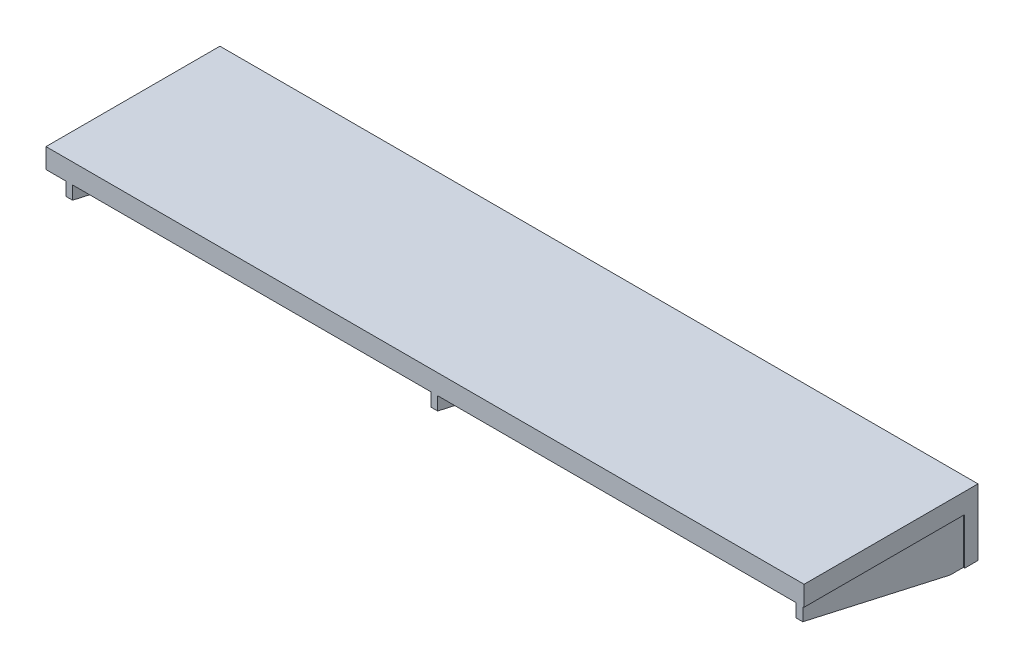
ISO-10303-21;
HEADER;
FILE_DESCRIPTION(('STEP AP214'),'2;1');
FILE_NAME('part.step','',(''),(''),'','','');
FILE_SCHEMA(('AUTOMOTIVE_DESIGN { 1 0 10303 214 1 1 1 1 }'));
ENDSEC;
DATA;
#1=APPLICATION_CONTEXT('core data for automotive mechanical design processes');
#2=APPLICATION_PROTOCOL_DEFINITION('international standard','automotive_design',2000,#1);
#3=PRODUCT_CONTEXT('',#1,'mechanical');
#4=PRODUCT('Part','Part','',(#3));
#5=PRODUCT_RELATED_PRODUCT_CATEGORY('part','',(#4));
#6=PRODUCT_DEFINITION_FORMATION('','',#4);
#7=PRODUCT_DEFINITION_CONTEXT('part definition',#1,'design');
#8=PRODUCT_DEFINITION('design','',#6,#7);
#9=PRODUCT_DEFINITION_SHAPE('','',#8);
#10=(LENGTH_UNIT() NAMED_UNIT(*) SI_UNIT(.MILLI.,.METRE.));
#11=(NAMED_UNIT(*) PLANE_ANGLE_UNIT() SI_UNIT($,.RADIAN.));
#12=(NAMED_UNIT(*) SI_UNIT($,.STERADIAN.) SOLID_ANGLE_UNIT());
#13=UNCERTAINTY_MEASURE_WITH_UNIT(LENGTH_MEASURE(1.E-05),#10,'distance_accuracy_value','');
#14=(GEOMETRIC_REPRESENTATION_CONTEXT(3) GLOBAL_UNCERTAINTY_ASSIGNED_CONTEXT((#13)) GLOBAL_UNIT_ASSIGNED_CONTEXT((#10,
#11,#12)) REPRESENTATION_CONTEXT('',''));
#15=CARTESIAN_POINT('',(0.,0.,0.));
#16=DIRECTION('',(0.,0.,1.));
#17=DIRECTION('',(1.,0.,0.));
#18=AXIS2_PLACEMENT_3D('',#15,#16,#17);
#19=CARTESIAN_POINT('',(0.,0.,20.));
#20=DIRECTION('',(0.,0.,-1.));
#21=DIRECTION('',(-1.,0.,0.));
#22=AXIS2_PLACEMENT_3D('',#19,#20,#21);
#23=PLANE('',#22);
#24=DIRECTION('',(0.,-1.,0.));
#25=VECTOR('',#24,1.);
#26=CARTESIAN_POINT('',(569.,20.,20.));
#27=LINE('',#26,#25);
#28=CARTESIAN_POINT('',(569.,20.,20.));
#29=VERTEX_POINT('',#28);
#30=CARTESIAN_POINT('',(569.,-50.,20.));
#31=VERTEX_POINT('',#30);
#32=EDGE_CURVE('E181',#29,#31,#27,.T.);
#33=ORIENTED_EDGE('',*,*,#32,.T.);
#34=DIRECTION('',(1.,0.,0.));
#35=VECTOR('',#34,1.);
#36=CARTESIAN_POINT('',(-571.,-50.,20.));
#37=LINE('',#36,#35);
#38=CARTESIAN_POINT('',(571.,-50.,20.));
#39=VERTEX_POINT('',#38);
#40=EDGE_CURVE('E39',#31,#39,#37,.T.);
#41=ORIENTED_EDGE('',*,*,#40,.T.);
#42=DIRECTION('',(0.,1.,0.));
#43=VECTOR('',#42,1.);
#44=CARTESIAN_POINT('',(571.,-50.,20.));
#45=LINE('',#44,#43);
#46=CARTESIAN_POINT('',(571.,20.,20.));
#47=VERTEX_POINT('',#46);
#48=EDGE_CURVE('E202',#39,#47,#45,.T.);
#49=ORIENTED_EDGE('',*,*,#48,.T.);
#50=DIRECTION('',(1.,0.,0.));
#51=VECTOR('',#50,1.);
#52=CARTESIAN_POINT('',(-571.,20.,20.));
#53=LINE('',#52,#51);
#54=EDGE_CURVE('E196',#29,#47,#53,.T.);
#55=ORIENTED_EDGE('',*,*,#54,.F.);
#56=EDGE_LOOP('',(#33,#41,#49,#55));
#57=FACE_BOUND('',#56,.T.);
#58=ADVANCED_FACE('F35',(#57),#23,.F.);
#59=CARTESIAN_POINT('',(-571.,20.,262.));
#60=DIRECTION('',(0.,1.,0.));
#61=DIRECTION('',(0.,0.,1.));
#62=AXIS2_PLACEMENT_3D('',#59,#60,#61);
#63=PLANE('',#62);
#64=DIRECTION('',(0.,0.,-1.));
#65=VECTOR('',#64,1.);
#66=CARTESIAN_POINT('',(569.,20.,262.));
#67=LINE('',#66,#65);
#68=CARTESIAN_POINT('',(569.,20.,262.));
#69=VERTEX_POINT('',#68);
#70=EDGE_CURVE('E184',#69,#29,#67,.T.);
#71=ORIENTED_EDGE('',*,*,#70,.T.);
#72=ORIENTED_EDGE('',*,*,#54,.T.);
#73=DIRECTION('',(0.,0.,-1.));
#74=VECTOR('',#73,1.);
#75=CARTESIAN_POINT('',(571.,20.,262.));
#76=LINE('',#75,#74);
#77=CARTESIAN_POINT('',(571.,20.,262.));
#78=VERTEX_POINT('',#77);
#79=EDGE_CURVE('E340',#78,#47,#76,.T.);
#80=ORIENTED_EDGE('',*,*,#79,.F.);
#81=DIRECTION('',(1.,0.,0.));
#82=VECTOR('',#81,1.);
#83=CARTESIAN_POINT('',(-571.,20.,262.));
#84=LINE('',#83,#82);
#85=EDGE_CURVE('E198',#69,#78,#84,.T.);
#86=ORIENTED_EDGE('',*,*,#85,.F.);
#87=EDGE_LOOP('',(#71,#72,#80,#86));
#88=FACE_BOUND('',#87,.T.);
#89=ADVANCED_FACE('F194',(#88),#63,.F.);
#90=CARTESIAN_POINT('',(19.0000000000002,-50.,20.));
#91=VERTEX_POINT('',#90);
#92=CARTESIAN_POINT('',(559.,-50.,20.));
#93=VERTEX_POINT('',#92);
#94=EDGE_CURVE('E285',#91,#93,#37,.T.);
#95=ORIENTED_EDGE('',*,*,#94,.T.);
#96=DIRECTION('',(0.,-1.,0.));
#97=VECTOR('',#96,1.);
#98=CARTESIAN_POINT('',(559.,20.,20.));
#99=LINE('',#98,#97);
#100=CARTESIAN_POINT('',(559.,20.,20.));
#101=VERTEX_POINT('',#100);
#102=EDGE_CURVE('E546',#101,#93,#99,.T.);
#103=ORIENTED_EDGE('',*,*,#102,.F.);
#104=CARTESIAN_POINT('',(19.0000000000002,20.,20.));
#105=VERTEX_POINT('',#104);
#106=EDGE_CURVE('E203',#105,#101,#53,.T.);
#107=ORIENTED_EDGE('',*,*,#106,.F.);
#108=DIRECTION('',(0.,-1.,0.));
#109=VECTOR('',#108,1.);
#110=CARTESIAN_POINT('',(19.0000000000002,20.,20.));
#111=LINE('',#110,#109);
#112=EDGE_CURVE('E562',#105,#91,#111,.T.);
#113=ORIENTED_EDGE('',*,*,#112,.T.);
#114=EDGE_LOOP('',(#95,#103,#107,#113));
#115=FACE_BOUND('',#114,.T.);
#116=ADVANCED_FACE('F379',(#115),#23,.F.);
#117=ORIENTED_EDGE('',*,*,#106,.T.);
#118=DIRECTION('',(0.,0.,-1.));
#119=VECTOR('',#118,1.);
#120=CARTESIAN_POINT('',(559.,20.,262.));
#121=LINE('',#120,#119);
#122=CARTESIAN_POINT('',(559.,20.,262.));
#123=VERTEX_POINT('',#122);
#124=EDGE_CURVE('E538',#123,#101,#121,.T.);
#125=ORIENTED_EDGE('',*,*,#124,.F.);
#126=CARTESIAN_POINT('',(19.0000000000002,20.,262.));
#127=VERTEX_POINT('',#126);
#128=EDGE_CURVE('E346',#127,#123,#84,.T.);
#129=ORIENTED_EDGE('',*,*,#128,.F.);
#130=DIRECTION('',(0.,0.,-1.));
#131=VECTOR('',#130,1.);
#132=CARTESIAN_POINT('',(19.0000000000002,20.,262.));
#133=LINE('',#132,#131);
#134=EDGE_CURVE('E560',#127,#105,#133,.T.);
#135=ORIENTED_EDGE('',*,*,#134,.T.);
#136=EDGE_LOOP('',(#117,#125,#129,#135));
#137=FACE_BOUND('',#136,.T.);
#138=ADVANCED_FACE('F384',(#137),#63,.F.);
#139=CARTESIAN_POINT('',(-571.,20.,20.));
#140=VERTEX_POINT('',#139);
#141=CARTESIAN_POINT('',(-541.,20.,20.));
#142=VERTEX_POINT('',#141);
#143=EDGE_CURVE('E206',#140,#142,#53,.T.);
#144=ORIENTED_EDGE('',*,*,#143,.F.);
#145=DIRECTION('',(0.,-1.,0.));
#146=VECTOR('',#145,1.);
#147=CARTESIAN_POINT('',(-571.,-50.,20.));
#148=LINE('',#147,#146);
#149=CARTESIAN_POINT('',(-571.,-50.,20.));
#150=VERTEX_POINT('',#149);
#151=EDGE_CURVE('E276',#140,#150,#148,.T.);
#152=ORIENTED_EDGE('',*,*,#151,.T.);
#153=CARTESIAN_POINT('',(-541.,-50.,20.));
#154=VERTEX_POINT('',#153);
#155=EDGE_CURVE('E284',#150,#154,#37,.T.);
#156=ORIENTED_EDGE('',*,*,#155,.T.);
#157=DIRECTION('',(0.,-1.,0.));
#158=VECTOR('',#157,1.);
#159=CARTESIAN_POINT('',(-541.,20.,20.));
#160=LINE('',#159,#158);
#161=EDGE_CURVE('E266',#142,#154,#160,.T.);
#162=ORIENTED_EDGE('',*,*,#161,.F.);
#163=EDGE_LOOP('',(#144,#152,#156,#162));
#164=FACE_BOUND('',#163,.T.);
#165=ADVANCED_FACE('F310',(#164),#23,.F.);
#166=CARTESIAN_POINT('',(-531.,-50.,20.));
#167=VERTEX_POINT('',#166);
#168=CARTESIAN_POINT('',(9.0000000000002,-50.,20.));
#169=VERTEX_POINT('',#168);
#170=EDGE_CURVE('E251',#167,#169,#37,.T.);
#171=ORIENTED_EDGE('',*,*,#170,.T.);
#172=DIRECTION('',(0.,-1.,0.));
#173=VECTOR('',#172,1.);
#174=CARTESIAN_POINT('',(9.0000000000002,20.,20.));
#175=LINE('',#174,#173);
#176=CARTESIAN_POINT('',(9.0000000000002,20.,20.));
#177=VERTEX_POINT('',#176);
#178=EDGE_CURVE('E236',#177,#169,#175,.T.);
#179=ORIENTED_EDGE('',*,*,#178,.F.);
#180=CARTESIAN_POINT('',(-531.,20.,20.));
#181=VERTEX_POINT('',#180);
#182=EDGE_CURVE('E208',#181,#177,#53,.T.);
#183=ORIENTED_EDGE('',*,*,#182,.F.);
#184=DIRECTION('',(0.,-1.,0.));
#185=VECTOR('',#184,1.);
#186=CARTESIAN_POINT('',(-531.,20.,20.));
#187=LINE('',#186,#185);
#188=EDGE_CURVE('E233',#181,#167,#187,.T.);
#189=ORIENTED_EDGE('',*,*,#188,.T.);
#190=EDGE_LOOP('',(#171,#179,#183,#189));
#191=FACE_BOUND('',#190,.T.);
#192=ADVANCED_FACE('F232',(#191),#23,.F.);
#193=CARTESIAN_POINT('',(571.,-50.,20.));
#194=DIRECTION('',(-1.,0.,0.));
#195=DIRECTION('',(0.,0.,1.));
#196=AXIS2_PLACEMENT_3D('',#193,#194,#195);
#197=PLANE('',#196);
#198=DIRECTION('',(0.,1.,0.));
#199=VECTOR('',#198,1.);
#200=CARTESIAN_POINT('',(571.,-50.,0.));
#201=LINE('',#200,#199);
#202=CARTESIAN_POINT('',(571.,-50.,0.));
#203=VERTEX_POINT('',#202);
#204=CARTESIAN_POINT('',(571.,50.,0.));
#205=VERTEX_POINT('',#204);
#206=EDGE_CURVE('E273',#203,#205,#201,.T.);
#207=ORIENTED_EDGE('',*,*,#206,.T.);
#208=DIRECTION('',(0.,0.,-1.));
#209=VECTOR('',#208,1.);
#210=CARTESIAN_POINT('',(571.,50.,20.));
#211=LINE('',#210,#209);
#212=CARTESIAN_POINT('',(571.,50.,262.));
#213=VERTEX_POINT('',#212);
#214=EDGE_CURVE('E11',#213,#205,#211,.T.);
#215=ORIENTED_EDGE('',*,*,#214,.F.);
#216=DIRECTION('',(0.,1.,0.));
#217=VECTOR('',#216,1.);
#218=CARTESIAN_POINT('',(571.,50.,262.));
#219=LINE('',#218,#217);
#220=EDGE_CURVE('E335',#78,#213,#219,.T.);
#221=ORIENTED_EDGE('',*,*,#220,.F.);
#222=ORIENTED_EDGE('',*,*,#79,.T.);
#223=ORIENTED_EDGE('',*,*,#48,.F.);
#224=DIRECTION('',(0.,0.,-1.));
#225=VECTOR('',#224,1.);
#226=CARTESIAN_POINT('',(571.,-50.,20.));
#227=LINE('',#226,#225);
#228=EDGE_CURVE('E314',#39,#203,#227,.T.);
#229=ORIENTED_EDGE('',*,*,#228,.T.);
#230=EDGE_LOOP('',(#207,#215,#221,#222,#223,#229));
#231=FACE_BOUND('',#230,.T.);
#232=ADVANCED_FACE('F37',(#231),#197,.F.);
#233=CARTESIAN_POINT('',(-571.,50.,20.));
#234=DIRECTION('',(0.,-1.,0.));
#235=DIRECTION('',(0.,0.,-1.));
#236=AXIS2_PLACEMENT_3D('',#233,#234,#235);
#237=PLANE('',#236);
#238=DIRECTION('',(-1.,0.,0.));
#239=VECTOR('',#238,1.);
#240=CARTESIAN_POINT('',(-571.,50.,0.));
#241=LINE('',#240,#239);
#242=CARTESIAN_POINT('',(-571.,50.,0.));
#243=VERTEX_POINT('',#242);
#244=EDGE_CURVE('E355',#205,#243,#241,.T.);
#245=ORIENTED_EDGE('',*,*,#244,.T.);
#246=DIRECTION('',(0.,0.,-1.));
#247=VECTOR('',#246,1.);
#248=CARTESIAN_POINT('',(-571.,50.,20.));
#249=LINE('',#248,#247);
#250=CARTESIAN_POINT('',(-571.,50.,262.));
#251=VERTEX_POINT('',#250);
#252=EDGE_CURVE('E45',#251,#243,#249,.T.);
#253=ORIENTED_EDGE('',*,*,#252,.F.);
#254=DIRECTION('',(-1.,0.,0.));
#255=VECTOR('',#254,1.);
#256=CARTESIAN_POINT('',(-571.,50.,262.));
#257=LINE('',#256,#255);
#258=EDGE_CURVE('E338',#213,#251,#257,.T.);
#259=ORIENTED_EDGE('',*,*,#258,.F.);
#260=ORIENTED_EDGE('',*,*,#214,.T.);
#261=EDGE_LOOP('',(#245,#253,#259,#260));
#262=FACE_BOUND('',#261,.T.);
#263=ADVANCED_FACE('F354',(#262),#237,.F.);
#264=CARTESIAN_POINT('',(-571.,-50.,20.));
#265=DIRECTION('',(1.,0.,0.));
#266=DIRECTION('',(0.,0.,-1.));
#267=AXIS2_PLACEMENT_3D('',#264,#265,#266);
#268=PLANE('',#267);
#269=DIRECTION('',(0.,-1.,0.));
#270=VECTOR('',#269,1.);
#271=CARTESIAN_POINT('',(-571.,-50.,0.));
#272=LINE('',#271,#270);
#273=CARTESIAN_POINT('',(-571.,-50.,0.));
#274=VERTEX_POINT('',#273);
#275=EDGE_CURVE('E363',#243,#274,#272,.T.);
#276=ORIENTED_EDGE('',*,*,#275,.T.);
#277=DIRECTION('',(0.,0.,-1.));
#278=VECTOR('',#277,1.);
#279=CARTESIAN_POINT('',(-571.,-50.,20.));
#280=LINE('',#279,#278);
#281=EDGE_CURVE('E316',#150,#274,#280,.T.);
#282=ORIENTED_EDGE('',*,*,#281,.F.);
#283=ORIENTED_EDGE('',*,*,#151,.F.);
#284=DIRECTION('',(0.,0.,-1.));
#285=VECTOR('',#284,1.);
#286=CARTESIAN_POINT('',(-571.,20.,262.));
#287=LINE('',#286,#285);
#288=CARTESIAN_POINT('',(-571.,20.,262.));
#289=VERTEX_POINT('',#288);
#290=EDGE_CURVE('E264',#289,#140,#287,.T.);
#291=ORIENTED_EDGE('',*,*,#290,.F.);
#292=DIRECTION('',(0.,-1.,0.));
#293=VECTOR('',#292,1.);
#294=CARTESIAN_POINT('',(-571.,50.,262.));
#295=LINE('',#294,#293);
#296=EDGE_CURVE('E213',#251,#289,#295,.T.);
#297=ORIENTED_EDGE('',*,*,#296,.F.);
#298=ORIENTED_EDGE('',*,*,#252,.T.);
#299=EDGE_LOOP('',(#276,#282,#283,#291,#297,#298));
#300=FACE_BOUND('',#299,.T.);
#301=ADVANCED_FACE('F364',(#300),#268,.F.);
#302=CARTESIAN_POINT('',(-571.,-50.,20.));
#303=DIRECTION('',(0.,1.,0.));
#304=DIRECTION('',(0.,0.,1.));
#305=AXIS2_PLACEMENT_3D('',#302,#303,#304);
#306=PLANE('',#305);
#307=DIRECTION('',(1.,0.,0.));
#308=VECTOR('',#307,1.);
#309=CARTESIAN_POINT('',(-571.,-50.,0.));
#310=LINE('',#309,#308);
#311=EDGE_CURVE('E277',#274,#203,#310,.T.);
#312=ORIENTED_EDGE('',*,*,#311,.T.);
#313=ORIENTED_EDGE('',*,*,#228,.F.);
#314=ORIENTED_EDGE('',*,*,#40,.F.);
#315=DIRECTION('',(0.,0.,1.));
#316=VECTOR('',#315,1.);
#317=CARTESIAN_POINT('',(569.,-50.,20.));
#318=LINE('',#317,#316);
#319=CARTESIAN_POINT('',(569.,-50.,40.));
#320=VERTEX_POINT('',#319);
#321=EDGE_CURVE('E188',#31,#320,#318,.T.);
#322=ORIENTED_EDGE('',*,*,#321,.T.);
#323=DIRECTION('',(-1.,0.,0.));
#324=VECTOR('',#323,1.);
#325=CARTESIAN_POINT('',(569.,-50.,40.));
#326=LINE('',#325,#324);
#327=CARTESIAN_POINT('',(559.,-50.,40.));
#328=VERTEX_POINT('',#327);
#329=EDGE_CURVE('E556',#320,#328,#326,.T.);
#330=ORIENTED_EDGE('',*,*,#329,.T.);
#331=DIRECTION('',(0.,0.,1.));
#332=VECTOR('',#331,1.);
#333=CARTESIAN_POINT('',(559.,-50.,20.));
#334=LINE('',#333,#332);
#335=EDGE_CURVE('E548',#93,#328,#334,.T.);
#336=ORIENTED_EDGE('',*,*,#335,.F.);
#337=ORIENTED_EDGE('',*,*,#94,.F.);
#338=DIRECTION('',(0.,0.,1.));
#339=VECTOR('',#338,1.);
#340=CARTESIAN_POINT('',(19.0000000000002,-50.,20.));
#341=LINE('',#340,#339);
#342=CARTESIAN_POINT('',(19.0000000000002,-50.,40.));
#343=VERTEX_POINT('',#342);
#344=EDGE_CURVE('E565',#91,#343,#341,.T.);
#345=ORIENTED_EDGE('',*,*,#344,.T.);
#346=DIRECTION('',(-1.,0.,0.));
#347=VECTOR('',#346,1.);
#348=CARTESIAN_POINT('',(19.0000000000002,-50.,40.));
#349=LINE('',#348,#347);
#350=CARTESIAN_POINT('',(9.0000000000002,-50.,40.));
#351=VERTEX_POINT('',#350);
#352=EDGE_CURVE('E209',#343,#351,#349,.T.);
#353=ORIENTED_EDGE('',*,*,#352,.T.);
#354=DIRECTION('',(0.,0.,1.));
#355=VECTOR('',#354,1.);
#356=CARTESIAN_POINT('',(9.0000000000002,-50.,20.));
#357=LINE('',#356,#355);
#358=EDGE_CURVE('E320',#169,#351,#357,.T.);
#359=ORIENTED_EDGE('',*,*,#358,.F.);
#360=ORIENTED_EDGE('',*,*,#170,.F.);
#361=DIRECTION('',(0.,0.,1.));
#362=VECTOR('',#361,1.);
#363=CARTESIAN_POINT('',(-531.,-50.,20.));
#364=LINE('',#363,#362);
#365=CARTESIAN_POINT('',(-531.,-50.,40.));
#366=VERTEX_POINT('',#365);
#367=EDGE_CURVE('E243',#167,#366,#364,.T.);
#368=ORIENTED_EDGE('',*,*,#367,.T.);
#369=DIRECTION('',(-1.,0.,0.));
#370=VECTOR('',#369,1.);
#371=CARTESIAN_POINT('',(-531.,-50.,40.));
#372=LINE('',#371,#370);
#373=CARTESIAN_POINT('',(-541.,-50.,40.));
#374=VERTEX_POINT('',#373);
#375=EDGE_CURVE('E259',#366,#374,#372,.T.);
#376=ORIENTED_EDGE('',*,*,#375,.T.);
#377=DIRECTION('',(0.,0.,1.));
#378=VECTOR('',#377,1.);
#379=CARTESIAN_POINT('',(-541.,-50.,20.));
#380=LINE('',#379,#378);
#381=EDGE_CURVE('E270',#154,#374,#380,.T.);
#382=ORIENTED_EDGE('',*,*,#381,.F.);
#383=ORIENTED_EDGE('',*,*,#155,.F.);
#384=ORIENTED_EDGE('',*,*,#281,.T.);
#385=EDGE_LOOP('',(#312,#313,#314,#322,#330,#336,#337,#345,#353,#359,#360,#368,#376,#382,#383,#384));
#386=FACE_BOUND('',#385,.T.);
#387=ADVANCED_FACE('F318',(#386),#306,.F.);
#388=CARTESIAN_POINT('',(0.,0.,0.));
#389=DIRECTION('',(0.,0.,-1.));
#390=DIRECTION('',(-1.,0.,0.));
#391=AXIS2_PLACEMENT_3D('',#388,#389,#390);
#392=PLANE('',#391);
#393=ORIENTED_EDGE('',*,*,#206,.F.);
#394=ORIENTED_EDGE('',*,*,#311,.F.);
#395=ORIENTED_EDGE('',*,*,#275,.F.);
#396=ORIENTED_EDGE('',*,*,#244,.F.);
#397=EDGE_LOOP('',(#393,#394,#395,#396));
#398=FACE_BOUND('',#397,.T.);
#399=ADVANCED_FACE('F368',(#398),#392,.T.);
#400=CARTESIAN_POINT('',(-531.,0.,262.));
#401=DIRECTION('',(0.,0.,1.));
#402=DIRECTION('',(1.,0.,0.));
#403=AXIS2_PLACEMENT_3D('',#400,#401,#402);
#404=PLANE('',#403);
#405=DIRECTION('',(0.,1.,0.));
#406=VECTOR('',#405,1.);
#407=CARTESIAN_POINT('',(-541.,0.,262.));
#408=LINE('',#407,#406);
#409=CARTESIAN_POINT('',(-541.,0.,262.));
#410=VERTEX_POINT('',#409);
#411=CARTESIAN_POINT('',(-541.,20.,262.));
#412=VERTEX_POINT('',#411);
#413=EDGE_CURVE('E260',#410,#412,#408,.T.);
#414=ORIENTED_EDGE('',*,*,#413,.F.);
#415=DIRECTION('',(-1.,0.,0.));
#416=VECTOR('',#415,1.);
#417=CARTESIAN_POINT('',(-531.,0.,262.));
#418=LINE('',#417,#416);
#419=CARTESIAN_POINT('',(-531.,0.,262.));
#420=VERTEX_POINT('',#419);
#421=EDGE_CURVE('E271',#420,#410,#418,.T.);
#422=ORIENTED_EDGE('',*,*,#421,.F.);
#423=DIRECTION('',(0.,1.,0.));
#424=VECTOR('',#423,1.);
#425=CARTESIAN_POINT('',(-531.,0.,262.));
#426=LINE('',#425,#424);
#427=CARTESIAN_POINT('',(-531.,20.,262.));
#428=VERTEX_POINT('',#427);
#429=EDGE_CURVE('E247',#420,#428,#426,.T.);
#430=ORIENTED_EDGE('',*,*,#429,.T.);
#431=CARTESIAN_POINT('',(9.00000000000023,20.,262.));
#432=VERTEX_POINT('',#431);
#433=EDGE_CURVE('E336',#428,#432,#84,.T.);
#434=ORIENTED_EDGE('',*,*,#433,.T.);
#435=DIRECTION('',(0.,1.,0.));
#436=VECTOR('',#435,1.);
#437=CARTESIAN_POINT('',(9.0000000000002,0.,262.));
#438=LINE('',#437,#436);
#439=CARTESIAN_POINT('',(9.0000000000002,0.,262.));
#440=VERTEX_POINT('',#439);
#441=EDGE_CURVE('E61',#440,#432,#438,.T.);
#442=ORIENTED_EDGE('',*,*,#441,.F.);
#443=DIRECTION('',(-1.,0.,0.));
#444=VECTOR('',#443,1.);
#445=CARTESIAN_POINT('',(19.0000000000002,0.,262.));
#446=LINE('',#445,#444);
#447=CARTESIAN_POINT('',(19.0000000000002,0.,262.));
#448=VERTEX_POINT('',#447);
#449=EDGE_CURVE('E204',#448,#440,#446,.T.);
#450=ORIENTED_EDGE('',*,*,#449,.F.);
#451=DIRECTION('',(0.,1.,0.));
#452=VECTOR('',#451,1.);
#453=CARTESIAN_POINT('',(19.0000000000002,0.,262.));
#454=LINE('',#453,#452);
#455=EDGE_CURVE('E330',#448,#127,#454,.T.);
#456=ORIENTED_EDGE('',*,*,#455,.T.);
#457=ORIENTED_EDGE('',*,*,#128,.T.);
#458=DIRECTION('',(0.,1.,0.));
#459=VECTOR('',#458,1.);
#460=CARTESIAN_POINT('',(559.,0.,262.));
#461=LINE('',#460,#459);
#462=CARTESIAN_POINT('',(559.,0.,262.));
#463=VERTEX_POINT('',#462);
#464=EDGE_CURVE('E535',#463,#123,#461,.T.);
#465=ORIENTED_EDGE('',*,*,#464,.F.);
#466=DIRECTION('',(-1.,0.,0.));
#467=VECTOR('',#466,1.);
#468=CARTESIAN_POINT('',(569.,0.,262.));
#469=LINE('',#468,#467);
#470=CARTESIAN_POINT('',(569.,0.,262.));
#471=VERTEX_POINT('',#470);
#472=EDGE_CURVE('E554',#471,#463,#469,.T.);
#473=ORIENTED_EDGE('',*,*,#472,.F.);
#474=DIRECTION('',(0.,1.,0.));
#475=VECTOR('',#474,1.);
#476=CARTESIAN_POINT('',(569.,0.,262.));
#477=LINE('',#476,#475);
#478=EDGE_CURVE('E53',#471,#69,#477,.T.);
#479=ORIENTED_EDGE('',*,*,#478,.T.);
#480=ORIENTED_EDGE('',*,*,#85,.T.);
#481=ORIENTED_EDGE('',*,*,#220,.T.);
#482=ORIENTED_EDGE('',*,*,#258,.T.);
#483=ORIENTED_EDGE('',*,*,#296,.T.);
#484=EDGE_CURVE('E308',#289,#412,#84,.T.);
#485=ORIENTED_EDGE('',*,*,#484,.T.);
#486=EDGE_LOOP('',(#414,#422,#430,#434,#442,#450,#456,#457,#465,#473,#479,#480,#481,#482,#483,#485));
#487=FACE_BOUND('',#486,.T.);
#488=ADVANCED_FACE('F307',(#487),#404,.T.);
#489=CARTESIAN_POINT('',(-531.,-50.,40.));
#490=DIRECTION('',(0.,-0.975562678550501,0.21972132399786));
#491=DIRECTION('',(0.,-0.21972132399786,-0.975562678550501));
#492=AXIS2_PLACEMENT_3D('',#489,#490,#491);
#493=PLANE('',#492);
#494=DIRECTION('',(0.,0.21972132399786,0.9755626785505));
#495=VECTOR('',#494,1.);
#496=CARTESIAN_POINT('',(-541.,-50.,40.));
#497=LINE('',#496,#495);
#498=EDGE_CURVE('E267',#374,#410,#497,.T.);
#499=ORIENTED_EDGE('',*,*,#498,.F.);
#500=ORIENTED_EDGE('',*,*,#375,.F.);
#501=DIRECTION('',(0.,0.21972132399786,0.9755626785505));
#502=VECTOR('',#501,1.);
#503=CARTESIAN_POINT('',(-531.,-50.,40.));
#504=LINE('',#503,#502);
#505=EDGE_CURVE('E245',#366,#420,#504,.T.);
#506=ORIENTED_EDGE('',*,*,#505,.T.);
#507=ORIENTED_EDGE('',*,*,#421,.T.);
#508=EDGE_LOOP('',(#499,#500,#506,#507));
#509=FACE_BOUND('',#508,.T.);
#510=ADVANCED_FACE('F304',(#509),#493,.T.);
#511=CARTESIAN_POINT('',(-531.,0.,0.));
#512=DIRECTION('',(-1.,0.,0.));
#513=DIRECTION('',(0.,0.,1.));
#514=AXIS2_PLACEMENT_3D('',#511,#512,#513);
#515=PLANE('',#514);
#516=ORIENTED_EDGE('',*,*,#429,.F.);
#517=ORIENTED_EDGE('',*,*,#505,.F.);
#518=ORIENTED_EDGE('',*,*,#367,.F.);
#519=ORIENTED_EDGE('',*,*,#188,.F.);
#520=DIRECTION('',(0.,0.,-1.));
#521=VECTOR('',#520,1.);
#522=CARTESIAN_POINT('',(-531.,20.,262.));
#523=LINE('',#522,#521);
#524=EDGE_CURVE('E226',#428,#181,#523,.T.);
#525=ORIENTED_EDGE('',*,*,#524,.F.);
#526=EDGE_LOOP('',(#516,#517,#518,#519,#525));
#527=FACE_BOUND('',#526,.T.);
#528=ADVANCED_FACE('F239',(#527),#515,.F.);
#529=CARTESIAN_POINT('',(-541.,0.,0.));
#530=DIRECTION('',(-1.,0.,0.));
#531=DIRECTION('',(0.,0.,1.));
#532=AXIS2_PLACEMENT_3D('',#529,#530,#531);
#533=PLANE('',#532);
#534=ORIENTED_EDGE('',*,*,#413,.T.);
#535=DIRECTION('',(0.,0.,-1.));
#536=VECTOR('',#535,1.);
#537=CARTESIAN_POINT('',(-541.,20.,262.));
#538=LINE('',#537,#536);
#539=EDGE_CURVE('E263',#412,#142,#538,.T.);
#540=ORIENTED_EDGE('',*,*,#539,.T.);
#541=ORIENTED_EDGE('',*,*,#161,.T.);
#542=ORIENTED_EDGE('',*,*,#381,.T.);
#543=ORIENTED_EDGE('',*,*,#498,.T.);
#544=EDGE_LOOP('',(#534,#540,#541,#542,#543));
#545=FACE_BOUND('',#544,.T.);
#546=ADVANCED_FACE('F298',(#545),#533,.T.);
#547=ORIENTED_EDGE('',*,*,#182,.T.);
#548=DIRECTION('',(0.,0.,-1.));
#549=VECTOR('',#548,1.);
#550=CARTESIAN_POINT('',(9.0000000000002,20.,262.));
#551=LINE('',#550,#549);
#552=EDGE_CURVE('E223',#432,#177,#551,.T.);
#553=ORIENTED_EDGE('',*,*,#552,.F.);
#554=ORIENTED_EDGE('',*,*,#433,.F.);
#555=ORIENTED_EDGE('',*,*,#524,.T.);
#556=EDGE_LOOP('',(#547,#553,#554,#555));
#557=FACE_BOUND('',#556,.T.);
#558=ADVANCED_FACE('F222',(#557),#63,.F.);
#559=ORIENTED_EDGE('',*,*,#539,.F.);
#560=ORIENTED_EDGE('',*,*,#484,.F.);
#561=ORIENTED_EDGE('',*,*,#290,.T.);
#562=ORIENTED_EDGE('',*,*,#143,.T.);
#563=EDGE_LOOP('',(#559,#560,#561,#562));
#564=FACE_BOUND('',#563,.T.);
#565=ADVANCED_FACE('F385',(#564),#63,.F.);
#566=CARTESIAN_POINT('',(19.0000000000002,-50.,40.));
#567=DIRECTION('',(0.,-0.975562678550501,0.21972132399786));
#568=DIRECTION('',(0.,-0.21972132399786,-0.975562678550501));
#569=AXIS2_PLACEMENT_3D('',#566,#567,#568);
#570=PLANE('',#569);
#571=DIRECTION('',(0.,0.21972132399786,0.9755626785505));
#572=VECTOR('',#571,1.);
#573=CARTESIAN_POINT('',(9.0000000000002,-50.,40.));
#574=LINE('',#573,#572);
#575=EDGE_CURVE('E323',#351,#440,#574,.T.);
#576=ORIENTED_EDGE('',*,*,#575,.F.);
#577=ORIENTED_EDGE('',*,*,#352,.F.);
#578=DIRECTION('',(0.,0.21972132399786,0.9755626785505));
#579=VECTOR('',#578,1.);
#580=CARTESIAN_POINT('',(19.0000000000002,-50.,40.));
#581=LINE('',#580,#579);
#582=EDGE_CURVE('E332',#343,#448,#581,.T.);
#583=ORIENTED_EDGE('',*,*,#582,.T.);
#584=ORIENTED_EDGE('',*,*,#449,.T.);
#585=EDGE_LOOP('',(#576,#577,#583,#584));
#586=FACE_BOUND('',#585,.T.);
#587=ADVANCED_FACE('F403',(#586),#570,.T.);
#588=CARTESIAN_POINT('',(19.0000000000002,0.,0.));
#589=DIRECTION('',(-1.,0.,0.));
#590=DIRECTION('',(0.,0.,1.));
#591=AXIS2_PLACEMENT_3D('',#588,#589,#590);
#592=PLANE('',#591);
#593=ORIENTED_EDGE('',*,*,#455,.F.);
#594=ORIENTED_EDGE('',*,*,#582,.F.);
#595=ORIENTED_EDGE('',*,*,#344,.F.);
#596=ORIENTED_EDGE('',*,*,#112,.F.);
#597=ORIENTED_EDGE('',*,*,#134,.F.);
#598=EDGE_LOOP('',(#593,#594,#595,#596,#597));
#599=FACE_BOUND('',#598,.T.);
#600=ADVANCED_FACE('F485',(#599),#592,.F.);
#601=CARTESIAN_POINT('',(9.0000000000002,0.,0.));
#602=DIRECTION('',(-1.,0.,0.));
#603=DIRECTION('',(0.,0.,1.));
#604=AXIS2_PLACEMENT_3D('',#601,#602,#603);
#605=PLANE('',#604);
#606=ORIENTED_EDGE('',*,*,#441,.T.);
#607=ORIENTED_EDGE('',*,*,#552,.T.);
#608=ORIENTED_EDGE('',*,*,#178,.T.);
#609=ORIENTED_EDGE('',*,*,#358,.T.);
#610=ORIENTED_EDGE('',*,*,#575,.T.);
#611=EDGE_LOOP('',(#606,#607,#608,#609,#610));
#612=FACE_BOUND('',#611,.T.);
#613=ADVANCED_FACE('F325',(#612),#605,.T.);
#614=CARTESIAN_POINT('',(569.,-50.,40.));
#615=DIRECTION('',(0.,-0.975562678550501,0.21972132399786));
#616=DIRECTION('',(0.,-0.21972132399786,-0.975562678550501));
#617=AXIS2_PLACEMENT_3D('',#614,#615,#616);
#618=PLANE('',#617);
#619=DIRECTION('',(0.,0.21972132399786,0.9755626785505));
#620=VECTOR('',#619,1.);
#621=CARTESIAN_POINT('',(559.,-50.,40.));
#622=LINE('',#621,#620);
#623=EDGE_CURVE('E542',#328,#463,#622,.T.);
#624=ORIENTED_EDGE('',*,*,#623,.F.);
#625=ORIENTED_EDGE('',*,*,#329,.F.);
#626=DIRECTION('',(0.,0.21972132399786,0.9755626785505));
#627=VECTOR('',#626,1.);
#628=CARTESIAN_POINT('',(569.,-50.,40.));
#629=LINE('',#628,#627);
#630=EDGE_CURVE('E558',#320,#471,#629,.T.);
#631=ORIENTED_EDGE('',*,*,#630,.T.);
#632=ORIENTED_EDGE('',*,*,#472,.T.);
#633=EDGE_LOOP('',(#624,#625,#631,#632));
#634=FACE_BOUND('',#633,.T.);
#635=ADVANCED_FACE('F503',(#634),#618,.T.);
#636=CARTESIAN_POINT('',(569.,0.,0.));
#637=DIRECTION('',(-1.,0.,0.));
#638=DIRECTION('',(0.,0.,1.));
#639=AXIS2_PLACEMENT_3D('',#636,#637,#638);
#640=PLANE('',#639);
#641=ORIENTED_EDGE('',*,*,#478,.F.);
#642=ORIENTED_EDGE('',*,*,#630,.F.);
#643=ORIENTED_EDGE('',*,*,#321,.F.);
#644=ORIENTED_EDGE('',*,*,#32,.F.);
#645=ORIENTED_EDGE('',*,*,#70,.F.);
#646=EDGE_LOOP('',(#641,#642,#643,#644,#645));
#647=FACE_BOUND('',#646,.T.);
#648=ADVANCED_FACE('F183',(#647),#640,.F.);
#649=CARTESIAN_POINT('',(559.,0.,0.));
#650=DIRECTION('',(-1.,0.,0.));
#651=DIRECTION('',(0.,0.,1.));
#652=AXIS2_PLACEMENT_3D('',#649,#650,#651);
#653=PLANE('',#652);
#654=ORIENTED_EDGE('',*,*,#464,.T.);
#655=ORIENTED_EDGE('',*,*,#124,.T.);
#656=ORIENTED_EDGE('',*,*,#102,.T.);
#657=ORIENTED_EDGE('',*,*,#335,.T.);
#658=ORIENTED_EDGE('',*,*,#623,.T.);
#659=EDGE_LOOP('',(#654,#655,#656,#657,#658));
#660=FACE_BOUND('',#659,.T.);
#661=ADVANCED_FACE('F521',(#660),#653,.T.);
#662=CLOSED_SHELL('',(#58,#89,#116,#138,#165,#192,#232,#263,#301,#387,#399,#488,#510,#528,#546,
#558,#565,#587,#600,#613,#635,#648,#661));
#663=MANIFOLD_SOLID_BREP('B2',#662);
#664=ADVANCED_BREP_SHAPE_REPRESENTATION('',(#18,#663),#14);
#665=SHAPE_DEFINITION_REPRESENTATION(#9,#664);
ENDSEC;
END-ISO-10303-21;
